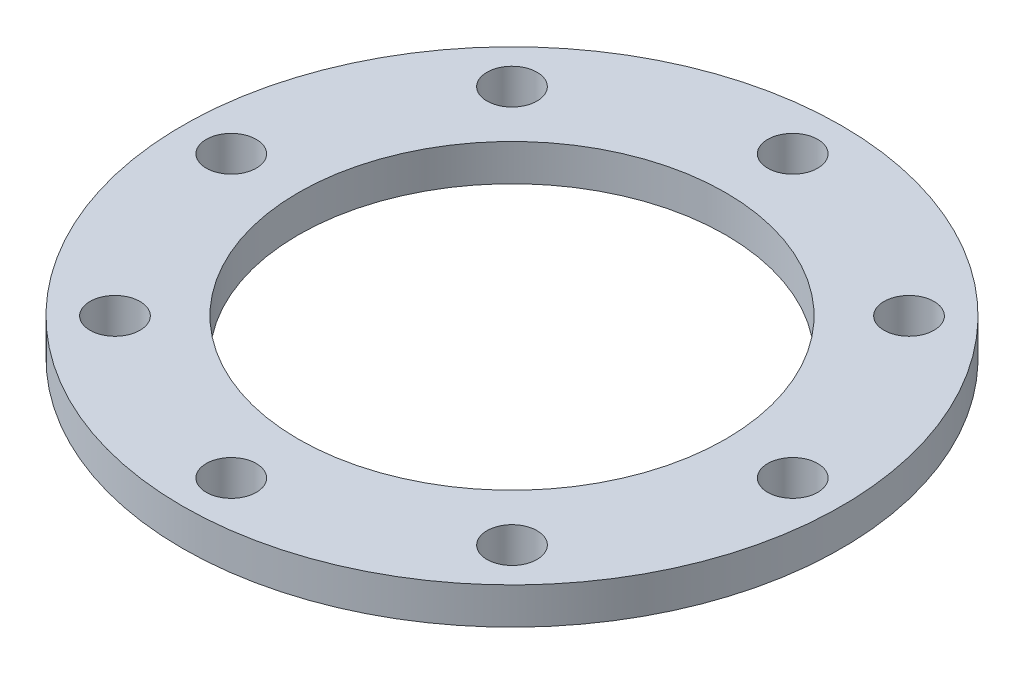
ISO-10303-21;
HEADER;
FILE_DESCRIPTION(('STEP AP214'),'2;1');
FILE_NAME('part.step','',(''),(''),'','','');
FILE_SCHEMA(('AUTOMOTIVE_DESIGN { 1 0 10303 214 1 1 1 1 }'));
ENDSEC;
DATA;
#1=APPLICATION_CONTEXT('core data for automotive mechanical design processes');
#2=APPLICATION_PROTOCOL_DEFINITION('international standard','automotive_design',2000,#1);
#3=PRODUCT_CONTEXT('',#1,'mechanical');
#4=PRODUCT('Part','Part','',(#3));
#5=PRODUCT_RELATED_PRODUCT_CATEGORY('part','',(#4));
#6=PRODUCT_DEFINITION_FORMATION('','',#4);
#7=PRODUCT_DEFINITION_CONTEXT('part definition',#1,'design');
#8=PRODUCT_DEFINITION('design','',#6,#7);
#9=PRODUCT_DEFINITION_SHAPE('','',#8);
#10=(LENGTH_UNIT() NAMED_UNIT(*) SI_UNIT(.MILLI.,.METRE.));
#11=(NAMED_UNIT(*) PLANE_ANGLE_UNIT() SI_UNIT($,.RADIAN.));
#12=(NAMED_UNIT(*) SI_UNIT($,.STERADIAN.) SOLID_ANGLE_UNIT());
#13=UNCERTAINTY_MEASURE_WITH_UNIT(LENGTH_MEASURE(1.E-05),#10,'distance_accuracy_value','');
#14=(GEOMETRIC_REPRESENTATION_CONTEXT(3) GLOBAL_UNCERTAINTY_ASSIGNED_CONTEXT((#13)) GLOBAL_UNIT_ASSIGNED_CONTEXT((#10,
#11,#12)) REPRESENTATION_CONTEXT('',''));
#15=CARTESIAN_POINT('',(0.,0.,0.));
#16=DIRECTION('',(0.,0.,1.));
#17=DIRECTION('',(1.,0.,0.));
#18=AXIS2_PLACEMENT_3D('',#15,#16,#17);
#19=CARTESIAN_POINT('',(0.,3.,0.));
#20=DIRECTION('',(0.,1.,0.));
#21=DIRECTION('',(0.,0.,1.));
#22=AXIS2_PLACEMENT_3D('',#19,#20,#21);
#23=PLANE('',#22);
#24=CARTESIAN_POINT('',(0.,3.,-23.));
#25=DIRECTION('',(0.,1.,0.));
#26=DIRECTION('',(1.,0.,0.));
#27=AXIS2_PLACEMENT_3D('',#24,#25,#26);
#28=CIRCLE('',#27,2.05);
#29=CARTESIAN_POINT('',(2.04999999999992,3.,-23.));
#30=VERTEX_POINT('',#29);
#31=EDGE_CURVE('E93',#30,#30,#28,.T.);
#32=ORIENTED_EDGE('',*,*,#31,.F.);
#33=EDGE_LOOP('',(#32));
#34=FACE_BOUND('',#33,.T.);
#35=CARTESIAN_POINT('',(-16.2634559672907,3.,-16.2634559672905));
#36=DIRECTION('',(0.,1.,0.));
#37=DIRECTION('',(0.707106781186544,0.,-0.707106781186551));
#38=AXIS2_PLACEMENT_3D('',#35,#36,#37);
#39=CIRCLE('',#38,2.05);
#40=CARTESIAN_POINT('',(-14.8138870658583,3.,-17.7130248687229));
#41=VERTEX_POINT('',#40);
#42=EDGE_CURVE('E84',#41,#41,#39,.T.);
#43=ORIENTED_EDGE('',*,*,#42,.F.);
#44=EDGE_LOOP('',(#43));
#45=FACE_BOUND('',#44,.T.);
#46=CARTESIAN_POINT('',(-23.,3.,0.));
#47=DIRECTION('',(0.,1.,0.));
#48=DIRECTION('',(0.,0.,-1.));
#49=AXIS2_PLACEMENT_3D('',#46,#47,#48);
#50=CIRCLE('',#49,2.05);
#51=CARTESIAN_POINT('',(-23.,3.,-2.05));
#52=VERTEX_POINT('',#51);
#53=EDGE_CURVE('E80',#52,#52,#50,.T.);
#54=ORIENTED_EDGE('',*,*,#53,.F.);
#55=EDGE_LOOP('',(#54));
#56=FACE_BOUND('',#55,.T.);
#57=CARTESIAN_POINT('',(-16.2634559672905,3.,16.2634559672907));
#58=DIRECTION('',(0.,1.,0.));
#59=DIRECTION('',(-0.707106781186554,0.,-0.707106781186541));
#60=AXIS2_PLACEMENT_3D('',#57,#58,#59);
#61=CIRCLE('',#60,2.05);
#62=CARTESIAN_POINT('',(-17.7130248687229,3.,14.8138870658583));
#63=VERTEX_POINT('',#62);
#64=EDGE_CURVE('E75',#63,#63,#61,.T.);
#65=ORIENTED_EDGE('',*,*,#64,.F.);
#66=EDGE_LOOP('',(#65));
#67=FACE_BOUND('',#66,.T.);
#68=CARTESIAN_POINT('',(2.40912212380176E-13,3.,23.));
#69=DIRECTION('',(0.,1.,0.));
#70=DIRECTION('',(-1.,0.,0.));
#71=AXIS2_PLACEMENT_3D('',#68,#69,#70);
#72=CIRCLE('',#71,2.05);
#73=CARTESIAN_POINT('',(-2.04999999999976,3.,23.));
#74=VERTEX_POINT('',#73);
#75=EDGE_CURVE('E105',#74,#74,#72,.T.);
#76=ORIENTED_EDGE('',*,*,#75,.F.);
#77=EDGE_LOOP('',(#76));
#78=FACE_BOUND('',#77,.T.);
#79=CARTESIAN_POINT('',(16.2634559672908,3.,16.2634559672904));
#80=DIRECTION('',(0.,1.,0.));
#81=DIRECTION('',(-0.707106781186539,0.,0.707106781186556));
#82=AXIS2_PLACEMENT_3D('',#79,#80,#81);
#83=CIRCLE('',#82,2.05);
#84=CARTESIAN_POINT('',(14.8138870658584,3.,17.7130248687228));
#85=VERTEX_POINT('',#84);
#86=EDGE_CURVE('E96',#85,#85,#83,.T.);
#87=ORIENTED_EDGE('',*,*,#86,.F.);
#88=EDGE_LOOP('',(#87));
#89=FACE_BOUND('',#88,.T.);
#90=CARTESIAN_POINT('',(16.2634559672906,3.,-16.2634559672906));
#91=DIRECTION('',(0.,1.,0.));
#92=DIRECTION('',(0.707106781186549,0.,0.707106781186546));
#93=AXIS2_PLACEMENT_3D('',#90,#91,#92);
#94=CIRCLE('',#93,2.05);
#95=CARTESIAN_POINT('',(17.713024868723,3.,-14.8138870658582));
#96=VERTEX_POINT('',#95);
#97=EDGE_CURVE('E66',#96,#96,#94,.T.);
#98=ORIENTED_EDGE('',*,*,#97,.F.);
#99=EDGE_LOOP('',(#98));
#100=FACE_BOUND('',#99,.T.);
#101=CARTESIAN_POINT('',(23.,3.,0.));
#102=DIRECTION('',(0.,1.,0.));
#103=DIRECTION('',(0.,0.,1.));
#104=AXIS2_PLACEMENT_3D('',#101,#102,#103);
#105=CIRCLE('',#104,2.05);
#106=CARTESIAN_POINT('',(23.,3.,2.05));
#107=VERTEX_POINT('',#106);
#108=EDGE_CURVE('E58',#107,#107,#105,.T.);
#109=ORIENTED_EDGE('',*,*,#108,.F.);
#110=EDGE_LOOP('',(#109));
#111=FACE_BOUND('',#110,.T.);
#112=CARTESIAN_POINT('',(0.,3.,0.));
#113=DIRECTION('',(0.,1.,0.));
#114=DIRECTION('',(0.,0.,1.));
#115=AXIS2_PLACEMENT_3D('',#112,#113,#114);
#116=CIRCLE('',#115,27.);
#117=CARTESIAN_POINT('',(0.,3.,27.));
#118=VERTEX_POINT('',#117);
#119=EDGE_CURVE('E10',#118,#118,#116,.T.);
#120=ORIENTED_EDGE('',*,*,#119,.T.);
#121=EDGE_LOOP('',(#120));
#122=FACE_BOUND('',#121,.T.);
#123=CARTESIAN_POINT('',(0.,3.,0.));
#124=DIRECTION('',(0.,1.,0.));
#125=DIRECTION('',(0.,0.,1.));
#126=AXIS2_PLACEMENT_3D('',#123,#124,#125);
#127=CIRCLE('',#126,17.5);
#128=CARTESIAN_POINT('',(0.,3.,17.5));
#129=VERTEX_POINT('',#128);
#130=EDGE_CURVE('E55',#129,#129,#127,.T.);
#131=ORIENTED_EDGE('',*,*,#130,.F.);
#132=EDGE_LOOP('',(#131));
#133=FACE_BOUND('',#132,.T.);
#134=ADVANCED_FACE('F41',(#34,#45,#56,#67,#78,#89,#100,#111,#122,#133),#23,.T.);
#135=CARTESIAN_POINT('',(0.,0.,0.));
#136=DIRECTION('',(0.,1.,0.));
#137=DIRECTION('',(0.,0.,1.));
#138=AXIS2_PLACEMENT_3D('',#135,#136,#137);
#139=PLANE('',#138);
#140=CARTESIAN_POINT('',(0.,0.,-23.));
#141=DIRECTION('',(0.,1.,0.));
#142=DIRECTION('',(1.,0.,0.));
#143=AXIS2_PLACEMENT_3D('',#140,#141,#142);
#144=CIRCLE('',#143,2.05);
#145=CARTESIAN_POINT('',(2.04999999999992,0.,-23.));
#146=VERTEX_POINT('',#145);
#147=EDGE_CURVE('E68',#146,#146,#144,.T.);
#148=ORIENTED_EDGE('',*,*,#147,.T.);
#149=EDGE_LOOP('',(#148));
#150=FACE_BOUND('',#149,.T.);
#151=CARTESIAN_POINT('',(-16.2634559672907,0.,-16.2634559672905));
#152=DIRECTION('',(0.,1.,0.));
#153=DIRECTION('',(0.707106781186544,0.,-0.707106781186551));
#154=AXIS2_PLACEMENT_3D('',#151,#152,#153);
#155=CIRCLE('',#154,2.05);
#156=CARTESIAN_POINT('',(-14.8138870658583,0.,-17.7130248687229));
#157=VERTEX_POINT('',#156);
#158=EDGE_CURVE('E86',#157,#157,#155,.T.);
#159=ORIENTED_EDGE('',*,*,#158,.T.);
#160=EDGE_LOOP('',(#159));
#161=FACE_BOUND('',#160,.T.);
#162=CARTESIAN_POINT('',(-23.,0.,0.));
#163=DIRECTION('',(0.,1.,0.));
#164=DIRECTION('',(0.,0.,-1.));
#165=AXIS2_PLACEMENT_3D('',#162,#163,#164);
#166=CIRCLE('',#165,2.05);
#167=CARTESIAN_POINT('',(-23.,0.,-2.05));
#168=VERTEX_POINT('',#167);
#169=EDGE_CURVE('E85',#168,#168,#166,.T.);
#170=ORIENTED_EDGE('',*,*,#169,.T.);
#171=EDGE_LOOP('',(#170));
#172=FACE_BOUND('',#171,.T.);
#173=CARTESIAN_POINT('',(-16.2634559672905,0.,16.2634559672907));
#174=DIRECTION('',(0.,1.,0.));
#175=DIRECTION('',(-0.707106781186554,0.,-0.707106781186541));
#176=AXIS2_PLACEMENT_3D('',#173,#174,#175);
#177=CIRCLE('',#176,2.05);
#178=CARTESIAN_POINT('',(-17.7130248687229,0.,14.8138870658583));
#179=VERTEX_POINT('',#178);
#180=EDGE_CURVE('E73',#179,#179,#177,.T.);
#181=ORIENTED_EDGE('',*,*,#180,.T.);
#182=EDGE_LOOP('',(#181));
#183=FACE_BOUND('',#182,.T.);
#184=CARTESIAN_POINT('',(2.40912212380176E-13,0.,23.));
#185=DIRECTION('',(0.,1.,0.));
#186=DIRECTION('',(-1.,0.,0.));
#187=AXIS2_PLACEMENT_3D('',#184,#185,#186);
#188=CIRCLE('',#187,2.05);
#189=CARTESIAN_POINT('',(-2.04999999999976,0.,23.));
#190=VERTEX_POINT('',#189);
#191=EDGE_CURVE('E78',#190,#190,#188,.T.);
#192=ORIENTED_EDGE('',*,*,#191,.T.);
#193=EDGE_LOOP('',(#192));
#194=FACE_BOUND('',#193,.T.);
#195=CARTESIAN_POINT('',(16.2634559672908,0.,16.2634559672904));
#196=DIRECTION('',(0.,1.,0.));
#197=DIRECTION('',(-0.707106781186539,0.,0.707106781186556));
#198=AXIS2_PLACEMENT_3D('',#195,#196,#197);
#199=CIRCLE('',#198,2.05);
#200=CARTESIAN_POINT('',(14.8138870658584,0.,17.7130248687228));
#201=VERTEX_POINT('',#200);
#202=EDGE_CURVE('E97',#201,#201,#199,.T.);
#203=ORIENTED_EDGE('',*,*,#202,.T.);
#204=EDGE_LOOP('',(#203));
#205=FACE_BOUND('',#204,.T.);
#206=CARTESIAN_POINT('',(16.2634559672906,0.,-16.2634559672906));
#207=DIRECTION('',(0.,1.,0.));
#208=DIRECTION('',(0.707106781186549,0.,0.707106781186546));
#209=AXIS2_PLACEMENT_3D('',#206,#207,#208);
#210=CIRCLE('',#209,2.05);
#211=CARTESIAN_POINT('',(17.713024868723,0.,-14.8138870658582));
#212=VERTEX_POINT('',#211);
#213=EDGE_CURVE('E62',#212,#212,#210,.T.);
#214=ORIENTED_EDGE('',*,*,#213,.T.);
#215=EDGE_LOOP('',(#214));
#216=FACE_BOUND('',#215,.T.);
#217=CARTESIAN_POINT('',(23.,0.,0.));
#218=DIRECTION('',(0.,1.,0.));
#219=DIRECTION('',(0.,0.,1.));
#220=AXIS2_PLACEMENT_3D('',#217,#218,#219);
#221=CIRCLE('',#220,2.05);
#222=CARTESIAN_POINT('',(23.,0.,2.05));
#223=VERTEX_POINT('',#222);
#224=EDGE_CURVE('E60',#223,#223,#221,.T.);
#225=ORIENTED_EDGE('',*,*,#224,.T.);
#226=EDGE_LOOP('',(#225));
#227=FACE_BOUND('',#226,.T.);
#228=CARTESIAN_POINT('',(0.,0.,0.));
#229=DIRECTION('',(0.,1.,0.));
#230=DIRECTION('',(0.,0.,1.));
#231=AXIS2_PLACEMENT_3D('',#228,#229,#230);
#232=CIRCLE('',#231,27.);
#233=CARTESIAN_POINT('',(0.,0.,27.));
#234=VERTEX_POINT('',#233);
#235=EDGE_CURVE('E44',#234,#234,#232,.T.);
#236=ORIENTED_EDGE('',*,*,#235,.F.);
#237=EDGE_LOOP('',(#236));
#238=FACE_BOUND('',#237,.T.);
#239=CARTESIAN_POINT('',(0.,0.,0.));
#240=DIRECTION('',(0.,1.,0.));
#241=DIRECTION('',(0.,0.,1.));
#242=AXIS2_PLACEMENT_3D('',#239,#240,#241);
#243=CIRCLE('',#242,17.5);
#244=CARTESIAN_POINT('',(0.,0.,17.5));
#245=VERTEX_POINT('',#244);
#246=EDGE_CURVE('E53',#245,#245,#243,.T.);
#247=ORIENTED_EDGE('',*,*,#246,.T.);
#248=EDGE_LOOP('',(#247));
#249=FACE_BOUND('',#248,.T.);
#250=ADVANCED_FACE('F107',(#150,#161,#172,#183,#194,#205,#216,#227,#238,#249),#139,.F.);
#251=CARTESIAN_POINT('',(0.,3.,0.));
#252=DIRECTION('',(0.,-1.,0.));
#253=DIRECTION('',(0.,0.,-1.));
#254=AXIS2_PLACEMENT_3D('',#251,#252,#253);
#255=CYLINDRICAL_SURFACE('',#254,27.);
#256=ORIENTED_EDGE('',*,*,#119,.F.);
#257=EDGE_LOOP('',(#256));
#258=FACE_BOUND('',#257,.T.);
#259=ORIENTED_EDGE('',*,*,#235,.T.);
#260=EDGE_LOOP('',(#259));
#261=FACE_BOUND('',#260,.T.);
#262=ADVANCED_FACE('F43',(#258,#261),#255,.T.);
#263=CARTESIAN_POINT('',(0.,3.,0.));
#264=DIRECTION('',(0.,-1.,0.));
#265=DIRECTION('',(0.,0.,-1.));
#266=AXIS2_PLACEMENT_3D('',#263,#264,#265);
#267=CYLINDRICAL_SURFACE('',#266,17.5);
#268=ORIENTED_EDGE('',*,*,#130,.T.);
#269=EDGE_LOOP('',(#268));
#270=FACE_BOUND('',#269,.T.);
#271=ORIENTED_EDGE('',*,*,#246,.F.);
#272=EDGE_LOOP('',(#271));
#273=FACE_BOUND('',#272,.T.);
#274=ADVANCED_FACE('F133',(#270,#273),#267,.F.);
#275=CARTESIAN_POINT('',(23.,0.,0.));
#276=DIRECTION('',(0.,1.,0.));
#277=DIRECTION('',(0.,0.,1.));
#278=AXIS2_PLACEMENT_3D('',#275,#276,#277);
#279=CYLINDRICAL_SURFACE('',#278,2.05);
#280=ORIENTED_EDGE('',*,*,#224,.F.);
#281=EDGE_LOOP('',(#280));
#282=FACE_BOUND('',#281,.T.);
#283=ORIENTED_EDGE('',*,*,#108,.T.);
#284=EDGE_LOOP('',(#283));
#285=FACE_BOUND('',#284,.T.);
#286=ADVANCED_FACE('F135',(#282,#285),#279,.F.);
#287=CARTESIAN_POINT('',(16.2634559672906,0.,-16.2634559672906));
#288=DIRECTION('',(0.,1.,0.));
#289=DIRECTION('',(0.,0.,1.));
#290=AXIS2_PLACEMENT_3D('',#287,#288,#289);
#291=CYLINDRICAL_SURFACE('',#290,2.05);
#292=ORIENTED_EDGE('',*,*,#213,.F.);
#293=EDGE_LOOP('',(#292));
#294=FACE_BOUND('',#293,.T.);
#295=ORIENTED_EDGE('',*,*,#97,.T.);
#296=EDGE_LOOP('',(#295));
#297=FACE_BOUND('',#296,.T.);
#298=ADVANCED_FACE('F149',(#294,#297),#291,.F.);
#299=CARTESIAN_POINT('',(16.2634559672908,0.,16.2634559672904));
#300=DIRECTION('',(0.,1.,0.));
#301=DIRECTION('',(0.,0.,1.));
#302=AXIS2_PLACEMENT_3D('',#299,#300,#301);
#303=CYLINDRICAL_SURFACE('',#302,2.05);
#304=ORIENTED_EDGE('',*,*,#202,.F.);
#305=EDGE_LOOP('',(#304));
#306=FACE_BOUND('',#305,.T.);
#307=ORIENTED_EDGE('',*,*,#86,.T.);
#308=EDGE_LOOP('',(#307));
#309=FACE_BOUND('',#308,.T.);
#310=ADVANCED_FACE('F113',(#306,#309),#303,.F.);
#311=CARTESIAN_POINT('',(2.40912212380176E-13,0.,23.));
#312=DIRECTION('',(0.,1.,0.));
#313=DIRECTION('',(0.,0.,1.));
#314=AXIS2_PLACEMENT_3D('',#311,#312,#313);
#315=CYLINDRICAL_SURFACE('',#314,2.05);
#316=ORIENTED_EDGE('',*,*,#191,.F.);
#317=EDGE_LOOP('',(#316));
#318=FACE_BOUND('',#317,.T.);
#319=ORIENTED_EDGE('',*,*,#75,.T.);
#320=EDGE_LOOP('',(#319));
#321=FACE_BOUND('',#320,.T.);
#322=ADVANCED_FACE('F112',(#318,#321),#315,.F.);
#323=CARTESIAN_POINT('',(-16.2634559672905,0.,16.2634559672907));
#324=DIRECTION('',(0.,1.,0.));
#325=DIRECTION('',(0.,0.,1.));
#326=AXIS2_PLACEMENT_3D('',#323,#324,#325);
#327=CYLINDRICAL_SURFACE('',#326,2.05);
#328=ORIENTED_EDGE('',*,*,#180,.F.);
#329=EDGE_LOOP('',(#328));
#330=FACE_BOUND('',#329,.T.);
#331=ORIENTED_EDGE('',*,*,#64,.T.);
#332=EDGE_LOOP('',(#331));
#333=FACE_BOUND('',#332,.T.);
#334=ADVANCED_FACE('F111',(#330,#333),#327,.F.);
#335=CARTESIAN_POINT('',(-23.,0.,0.));
#336=DIRECTION('',(0.,1.,0.));
#337=DIRECTION('',(0.,0.,1.));
#338=AXIS2_PLACEMENT_3D('',#335,#336,#337);
#339=CYLINDRICAL_SURFACE('',#338,2.05);
#340=ORIENTED_EDGE('',*,*,#169,.F.);
#341=EDGE_LOOP('',(#340));
#342=FACE_BOUND('',#341,.T.);
#343=ORIENTED_EDGE('',*,*,#53,.T.);
#344=EDGE_LOOP('',(#343));
#345=FACE_BOUND('',#344,.T.);
#346=ADVANCED_FACE('F154',(#342,#345),#339,.F.);
#347=CARTESIAN_POINT('',(-16.2634559672907,0.,-16.2634559672905));
#348=DIRECTION('',(0.,1.,0.));
#349=DIRECTION('',(0.,0.,1.));
#350=AXIS2_PLACEMENT_3D('',#347,#348,#349);
#351=CYLINDRICAL_SURFACE('',#350,2.05);
#352=ORIENTED_EDGE('',*,*,#158,.F.);
#353=EDGE_LOOP('',(#352));
#354=FACE_BOUND('',#353,.T.);
#355=ORIENTED_EDGE('',*,*,#42,.T.);
#356=EDGE_LOOP('',(#355));
#357=FACE_BOUND('',#356,.T.);
#358=ADVANCED_FACE('F157',(#354,#357),#351,.F.);
#359=CARTESIAN_POINT('',(0.,0.,-23.));
#360=DIRECTION('',(0.,1.,0.));
#361=DIRECTION('',(0.,0.,1.));
#362=AXIS2_PLACEMENT_3D('',#359,#360,#361);
#363=CYLINDRICAL_SURFACE('',#362,2.05);
#364=ORIENTED_EDGE('',*,*,#147,.F.);
#365=EDGE_LOOP('',(#364));
#366=FACE_BOUND('',#365,.T.);
#367=ORIENTED_EDGE('',*,*,#31,.T.);
#368=EDGE_LOOP('',(#367));
#369=FACE_BOUND('',#368,.T.);
#370=ADVANCED_FACE('F162',(#366,#369),#363,.F.);
#371=CLOSED_SHELL('',(#134,#250,#262,#274,#286,#298,#310,#322,#334,#346,#358,#370));
#372=MANIFOLD_SOLID_BREP('B2',#371);
#373=ADVANCED_BREP_SHAPE_REPRESENTATION('',(#18,#372),#14);
#374=SHAPE_DEFINITION_REPRESENTATION(#9,#373);
ENDSEC;
END-ISO-10303-21;
